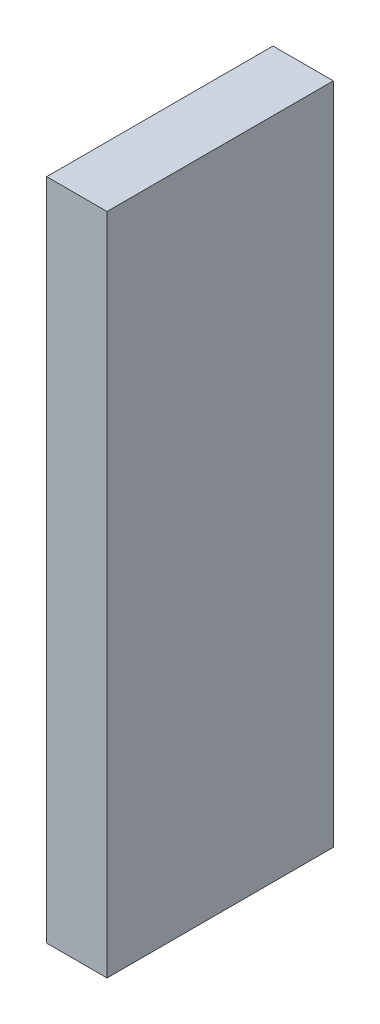
ISO-10303-21;
HEADER;
FILE_DESCRIPTION(('STEP AP214'),'2;1');
FILE_NAME('part.step','',(''),(''),'','','');
FILE_SCHEMA(('AUTOMOTIVE_DESIGN { 1 0 10303 214 1 1 1 1 }'));
ENDSEC;
DATA;
#1=APPLICATION_CONTEXT('core data for automotive mechanical design processes');
#2=APPLICATION_PROTOCOL_DEFINITION('international standard','automotive_design',2000,#1);
#3=PRODUCT_CONTEXT('',#1,'mechanical');
#4=PRODUCT('Part','Part','',(#3));
#5=PRODUCT_RELATED_PRODUCT_CATEGORY('part','',(#4));
#6=PRODUCT_DEFINITION_FORMATION('','',#4);
#7=PRODUCT_DEFINITION_CONTEXT('part definition',#1,'design');
#8=PRODUCT_DEFINITION('design','',#6,#7);
#9=PRODUCT_DEFINITION_SHAPE('','',#8);
#10=(LENGTH_UNIT() NAMED_UNIT(*) SI_UNIT(.MILLI.,.METRE.));
#11=(NAMED_UNIT(*) PLANE_ANGLE_UNIT() SI_UNIT($,.RADIAN.));
#12=(NAMED_UNIT(*) SI_UNIT($,.STERADIAN.) SOLID_ANGLE_UNIT());
#13=UNCERTAINTY_MEASURE_WITH_UNIT(LENGTH_MEASURE(1.E-05),#10,'distance_accuracy_value','');
#14=(GEOMETRIC_REPRESENTATION_CONTEXT(3) GLOBAL_UNCERTAINTY_ASSIGNED_CONTEXT((#13)) GLOBAL_UNIT_ASSIGNED_CONTEXT((#10,
#11,#12)) REPRESENTATION_CONTEXT('',''));
#15=CARTESIAN_POINT('',(0.,0.,0.));
#16=DIRECTION('',(0.,0.,1.));
#17=DIRECTION('',(1.,0.,0.));
#18=AXIS2_PLACEMENT_3D('',#15,#16,#17);
#19=CARTESIAN_POINT('',(0.,44.,15.));
#20=DIRECTION('',(1.,0.,0.));
#21=DIRECTION('',(0.,0.,-1.));
#22=AXIS2_PLACEMENT_3D('',#19,#20,#21);
#23=PLANE('',#22);
#24=DIRECTION('',(0.,-1.,0.));
#25=VECTOR('',#24,1.);
#26=CARTESIAN_POINT('',(0.,44.,0.));
#27=LINE('',#26,#25);
#28=CARTESIAN_POINT('',(0.,44.,0.));
#29=VERTEX_POINT('',#28);
#30=CARTESIAN_POINT('',(0.,0.,0.));
#31=VERTEX_POINT('',#30);
#32=EDGE_CURVE('E102',#29,#31,#27,.T.);
#33=ORIENTED_EDGE('',*,*,#32,.T.);
#34=DIRECTION('',(0.,0.,-1.));
#35=VECTOR('',#34,1.);
#36=CARTESIAN_POINT('',(0.,0.,15.));
#37=LINE('',#36,#35);
#38=CARTESIAN_POINT('',(0.,0.,15.));
#39=VERTEX_POINT('',#38);
#40=EDGE_CURVE('E11',#39,#31,#37,.T.);
#41=ORIENTED_EDGE('',*,*,#40,.F.);
#42=DIRECTION('',(0.,-1.,0.));
#43=VECTOR('',#42,1.);
#44=CARTESIAN_POINT('',(0.,44.,15.));
#45=LINE('',#44,#43);
#46=CARTESIAN_POINT('',(0.,44.,15.));
#47=VERTEX_POINT('',#46);
#48=EDGE_CURVE('E90',#47,#39,#45,.T.);
#49=ORIENTED_EDGE('',*,*,#48,.F.);
#50=DIRECTION('',(0.,0.,-1.));
#51=VECTOR('',#50,1.);
#52=CARTESIAN_POINT('',(0.,44.,15.));
#53=LINE('',#52,#51);
#54=EDGE_CURVE('E98',#47,#29,#53,.T.);
#55=ORIENTED_EDGE('',*,*,#54,.T.);
#56=EDGE_LOOP('',(#33,#41,#49,#55));
#57=FACE_BOUND('',#56,.T.);
#58=ADVANCED_FACE('F39',(#57),#23,.F.);
#59=CARTESIAN_POINT('',(0.,0.,15.));
#60=DIRECTION('',(0.,1.,0.));
#61=DIRECTION('',(0.,0.,1.));
#62=AXIS2_PLACEMENT_3D('',#59,#60,#61);
#63=PLANE('',#62);
#64=DIRECTION('',(1.,0.,0.));
#65=VECTOR('',#64,1.);
#66=CARTESIAN_POINT('',(0.,0.,0.));
#67=LINE('',#66,#65);
#68=CARTESIAN_POINT('',(4.,0.,0.));
#69=VERTEX_POINT('',#68);
#70=EDGE_CURVE('E94',#31,#69,#67,.T.);
#71=ORIENTED_EDGE('',*,*,#70,.T.);
#72=DIRECTION('',(0.,0.,-1.));
#73=VECTOR('',#72,1.);
#74=CARTESIAN_POINT('',(4.,0.,15.));
#75=LINE('',#74,#73);
#76=CARTESIAN_POINT('',(4.,0.,15.));
#77=VERTEX_POINT('',#76);
#78=EDGE_CURVE('E47',#77,#69,#75,.T.);
#79=ORIENTED_EDGE('',*,*,#78,.F.);
#80=DIRECTION('',(1.,0.,0.));
#81=VECTOR('',#80,1.);
#82=CARTESIAN_POINT('',(0.,0.,15.));
#83=LINE('',#82,#81);
#84=EDGE_CURVE('E85',#39,#77,#83,.T.);
#85=ORIENTED_EDGE('',*,*,#84,.F.);
#86=ORIENTED_EDGE('',*,*,#40,.T.);
#87=EDGE_LOOP('',(#71,#79,#85,#86));
#88=FACE_BOUND('',#87,.T.);
#89=ADVANCED_FACE('F93',(#88),#63,.F.);
#90=CARTESIAN_POINT('',(4.,0.,15.));
#91=DIRECTION('',(-1.,0.,0.));
#92=DIRECTION('',(0.,0.,1.));
#93=AXIS2_PLACEMENT_3D('',#90,#91,#92);
#94=PLANE('',#93);
#95=DIRECTION('',(0.,1.,0.));
#96=VECTOR('',#95,1.);
#97=CARTESIAN_POINT('',(4.,0.,0.));
#98=LINE('',#97,#96);
#99=CARTESIAN_POINT('',(4.,44.,0.));
#100=VERTEX_POINT('',#99);
#101=EDGE_CURVE('E72',#69,#100,#98,.T.);
#102=ORIENTED_EDGE('',*,*,#101,.T.);
#103=DIRECTION('',(0.,0.,-1.));
#104=VECTOR('',#103,1.);
#105=CARTESIAN_POINT('',(4.,44.,15.));
#106=LINE('',#105,#104);
#107=CARTESIAN_POINT('',(4.,44.,15.));
#108=VERTEX_POINT('',#107);
#109=EDGE_CURVE('E95',#108,#100,#106,.T.);
#110=ORIENTED_EDGE('',*,*,#109,.F.);
#111=DIRECTION('',(0.,1.,0.));
#112=VECTOR('',#111,1.);
#113=CARTESIAN_POINT('',(4.,0.,15.));
#114=LINE('',#113,#112);
#115=EDGE_CURVE('E88',#77,#108,#114,.T.);
#116=ORIENTED_EDGE('',*,*,#115,.F.);
#117=ORIENTED_EDGE('',*,*,#78,.T.);
#118=EDGE_LOOP('',(#102,#110,#116,#117));
#119=FACE_BOUND('',#118,.T.);
#120=ADVANCED_FACE('F96',(#119),#94,.F.);
#121=CARTESIAN_POINT('',(4.,44.,15.));
#122=DIRECTION('',(0.,-1.,0.));
#123=DIRECTION('',(0.,0.,-1.));
#124=AXIS2_PLACEMENT_3D('',#121,#122,#123);
#125=PLANE('',#124);
#126=DIRECTION('',(-1.,0.,0.));
#127=VECTOR('',#126,1.);
#128=CARTESIAN_POINT('',(4.,44.,0.));
#129=LINE('',#128,#127);
#130=EDGE_CURVE('E78',#100,#29,#129,.T.);
#131=ORIENTED_EDGE('',*,*,#130,.T.);
#132=ORIENTED_EDGE('',*,*,#54,.F.);
#133=DIRECTION('',(-1.,0.,0.));
#134=VECTOR('',#133,1.);
#135=CARTESIAN_POINT('',(4.,44.,15.));
#136=LINE('',#135,#134);
#137=EDGE_CURVE('E55',#108,#47,#136,.T.);
#138=ORIENTED_EDGE('',*,*,#137,.F.);
#139=ORIENTED_EDGE('',*,*,#109,.T.);
#140=EDGE_LOOP('',(#131,#132,#138,#139));
#141=FACE_BOUND('',#140,.T.);
#142=ADVANCED_FACE('F109',(#141),#125,.F.);
#143=CARTESIAN_POINT('',(0.,0.,15.));
#144=DIRECTION('',(0.,0.,1.));
#145=DIRECTION('',(1.,0.,0.));
#146=AXIS2_PLACEMENT_3D('',#143,#144,#145);
#147=PLANE('',#146);
#148=ORIENTED_EDGE('',*,*,#48,.T.);
#149=ORIENTED_EDGE('',*,*,#84,.T.);
#150=ORIENTED_EDGE('',*,*,#115,.T.);
#151=ORIENTED_EDGE('',*,*,#137,.T.);
#152=EDGE_LOOP('',(#148,#149,#150,#151));
#153=FACE_BOUND('',#152,.T.);
#154=ADVANCED_FACE('F86',(#153),#147,.T.);
#155=CARTESIAN_POINT('',(0.,0.,0.));
#156=DIRECTION('',(0.,0.,1.));
#157=DIRECTION('',(1.,0.,0.));
#158=AXIS2_PLACEMENT_3D('',#155,#156,#157);
#159=PLANE('',#158);
#160=ORIENTED_EDGE('',*,*,#32,.F.);
#161=ORIENTED_EDGE('',*,*,#130,.F.);
#162=ORIENTED_EDGE('',*,*,#101,.F.);
#163=ORIENTED_EDGE('',*,*,#70,.F.);
#164=EDGE_LOOP('',(#160,#161,#162,#163));
#165=FACE_BOUND('',#164,.T.);
#166=ADVANCED_FACE('F112',(#165),#159,.F.);
#167=CLOSED_SHELL('',(#58,#89,#120,#142,#154,#166));
#168=MANIFOLD_SOLID_BREP('B2',#167);
#169=ADVANCED_BREP_SHAPE_REPRESENTATION('',(#18,#168),#14);
#170=SHAPE_DEFINITION_REPRESENTATION(#9,#169);
ENDSEC;
END-ISO-10303-21;
